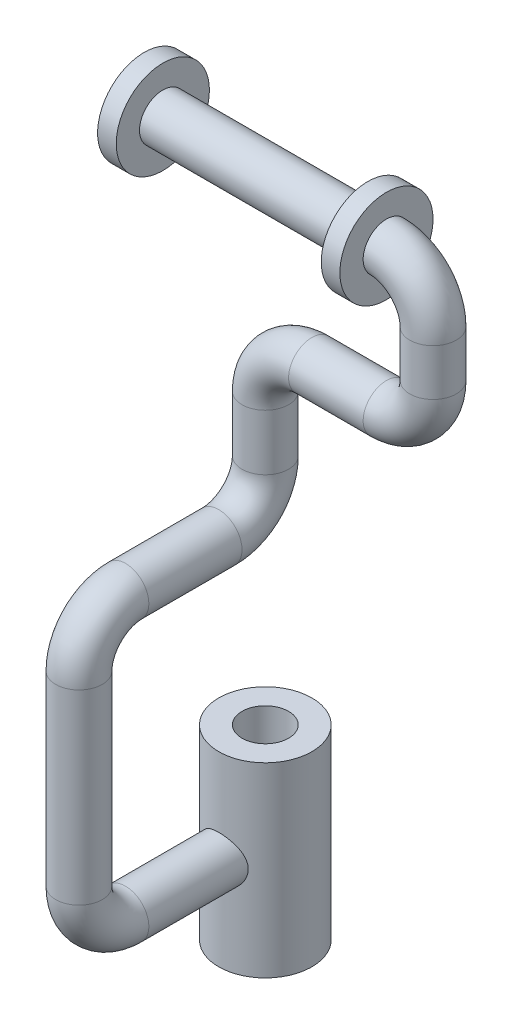
ISO-10303-21;
HEADER;
FILE_DESCRIPTION(('STEP AP214'),'2;1');
FILE_NAME('part.step','',(''),(''),'','','');
FILE_SCHEMA(('AUTOMOTIVE_DESIGN { 1 0 10303 214 1 1 1 1 }'));
ENDSEC;
DATA;
#1=APPLICATION_CONTEXT('core data for automotive mechanical design processes');
#2=APPLICATION_PROTOCOL_DEFINITION('international standard','automotive_design',2000,#1);
#3=PRODUCT_CONTEXT('',#1,'mechanical');
#4=PRODUCT('Part','Part','',(#3));
#5=PRODUCT_RELATED_PRODUCT_CATEGORY('part','',(#4));
#6=PRODUCT_DEFINITION_FORMATION('','',#4);
#7=PRODUCT_DEFINITION_CONTEXT('part definition',#1,'design');
#8=PRODUCT_DEFINITION('design','',#6,#7);
#9=PRODUCT_DEFINITION_SHAPE('','',#8);
#10=(LENGTH_UNIT() NAMED_UNIT(*) SI_UNIT(.MILLI.,.METRE.));
#11=(NAMED_UNIT(*) PLANE_ANGLE_UNIT() SI_UNIT($,.RADIAN.));
#12=(NAMED_UNIT(*) SI_UNIT($,.STERADIAN.) SOLID_ANGLE_UNIT());
#13=UNCERTAINTY_MEASURE_WITH_UNIT(LENGTH_MEASURE(1.E-05),#10,'distance_accuracy_value','');
#14=(GEOMETRIC_REPRESENTATION_CONTEXT(3) GLOBAL_UNCERTAINTY_ASSIGNED_CONTEXT((#13)) GLOBAL_UNIT_ASSIGNED_CONTEXT((#10,
#11,#12)) REPRESENTATION_CONTEXT('',''));
#15=CARTESIAN_POINT('',(0.,0.,0.));
#16=DIRECTION('',(0.,0.,1.));
#17=DIRECTION('',(1.,0.,0.));
#18=AXIS2_PLACEMENT_3D('',#15,#16,#17);
#19=CARTESIAN_POINT('',(13.,-20.,0.));
#20=DIRECTION('',(0.,-1.,0.));
#21=DIRECTION('',(0.,0.,-1.));
#22=AXIS2_PLACEMENT_3D('',#19,#20,#21);
#23=CYLINDRICAL_SURFACE('',#22,2.5);
#24=CARTESIAN_POINT('',(13.,-20.,0.));
#25=DIRECTION('',(0.,-1.,0.));
#26=DIRECTION('',(0.,0.,-1.));
#27=AXIS2_PLACEMENT_3D('',#24,#25,#26);
#28=CIRCLE('',#27,2.5);
#29=CARTESIAN_POINT('',(10.5,-20.,0.));
#30=VERTEX_POINT('',#29);
#31=EDGE_CURVE('E45',#30,#30,#28,.T.);
#32=ORIENTED_EDGE('',*,*,#31,.T.);
#33=EDGE_LOOP('',(#32));
#34=FACE_BOUND('',#33,.T.);
#35=CARTESIAN_POINT('',(13.,-26.,0.));
#36=DIRECTION('',(0.,-1.,0.));
#37=DIRECTION('',(1.,0.,0.));
#38=AXIS2_PLACEMENT_3D('',#35,#36,#37);
#39=CIRCLE('',#38,2.5);
#40=CARTESIAN_POINT('',(13.,-26.,-2.5));
#41=VERTEX_POINT('',#40);
#42=EDGE_CURVE('E96',#41,#41,#39,.T.);
#43=ORIENTED_EDGE('',*,*,#42,.F.);
#44=EDGE_LOOP('',(#43));
#45=FACE_BOUND('',#44,.T.);
#46=ADVANCED_FACE('F31',(#34,#45),#23,.T.);
#47=CARTESIAN_POINT('',(18.,-20.,0.));
#48=DIRECTION('',(0.,0.,1.));
#49=DIRECTION('',(1.,0.,0.));
#50=AXIS2_PLACEMENT_3D('',#47,#48,#49);
#51=TOROIDAL_SURFACE('',#50,5.,2.5);
#52=CARTESIAN_POINT('',(18.,-15.,0.));
#53=DIRECTION('',(-1.,0.,0.));
#54=DIRECTION('',(0.,0.,-1.));
#55=AXIS2_PLACEMENT_3D('',#52,#53,#54);
#56=CIRCLE('',#55,2.5);
#57=CARTESIAN_POINT('',(18.,-12.5,0.));
#58=VERTEX_POINT('',#57);
#59=EDGE_CURVE('E49',#58,#58,#56,.T.);
#60=CARTESIAN_POINT('',(18.,-20.,0.));
#61=DIRECTION('',(0.,0.,1.));
#62=DIRECTION('',(1.,0.,0.));
#63=AXIS2_PLACEMENT_3D('',#60,#61,#62);
#64=CIRCLE('',#63,7.5);
#65=EDGE_CURVE('',#58,#30,#64,.T.);
#66=ORIENTED_EDGE('',*,*,#59,.T.);
#67=ORIENTED_EDGE('',*,*,#31,.F.);
#68=ORIENTED_EDGE('',*,*,#65,.T.);
#69=ORIENTED_EDGE('',*,*,#65,.F.);
#70=EDGE_LOOP('',(#66,#68,#67,#69));
#71=FACE_BOUND('',#70,.T.);
#72=ADVANCED_FACE('F137',(#71),#51,.T.);
#73=CARTESIAN_POINT('',(26.,-15.,0.));
#74=DIRECTION('',(-1.,0.,0.));
#75=DIRECTION('',(0.,-1.,0.));
#76=AXIS2_PLACEMENT_3D('',#73,#74,#75);
#77=CYLINDRICAL_SURFACE('',#76,2.5);
#78=CARTESIAN_POINT('',(26.,-15.,0.));
#79=DIRECTION('',(-1.,0.,0.));
#80=DIRECTION('',(0.,0.,-1.));
#81=AXIS2_PLACEMENT_3D('',#78,#79,#80);
#82=CIRCLE('',#81,2.5);
#83=CARTESIAN_POINT('',(26.,-17.5,0.));
#84=VERTEX_POINT('',#83);
#85=EDGE_CURVE('E59',#84,#84,#82,.T.);
#86=ORIENTED_EDGE('',*,*,#85,.T.);
#87=EDGE_LOOP('',(#86));
#88=FACE_BOUND('',#87,.T.);
#89=ORIENTED_EDGE('',*,*,#59,.F.);
#90=EDGE_LOOP('',(#89));
#91=FACE_BOUND('',#90,.T.);
#92=ADVANCED_FACE('F142',(#88,#91),#77,.T.);
#93=CARTESIAN_POINT('',(26.,-10.,0.));
#94=DIRECTION('',(0.,0.,-1.));
#95=DIRECTION('',(-1.,0.,0.));
#96=AXIS2_PLACEMENT_3D('',#93,#94,#95);
#97=TOROIDAL_SURFACE('',#96,5.,2.5);
#98=CARTESIAN_POINT('',(31.,-10.,0.));
#99=DIRECTION('',(0.,-1.,0.));
#100=DIRECTION('',(0.,0.,-1.));
#101=AXIS2_PLACEMENT_3D('',#98,#99,#100);
#102=CIRCLE('',#101,2.5);
#103=CARTESIAN_POINT('',(33.5,-10.,0.));
#104=VERTEX_POINT('',#103);
#105=EDGE_CURVE('E62',#104,#104,#102,.T.);
#106=CARTESIAN_POINT('',(26.,-10.,0.));
#107=DIRECTION('',(0.,0.,-1.));
#108=DIRECTION('',(-1.,0.,0.));
#109=AXIS2_PLACEMENT_3D('',#106,#107,#108);
#110=CIRCLE('',#109,7.5);
#111=EDGE_CURVE('',#104,#84,#110,.T.);
#112=ORIENTED_EDGE('',*,*,#105,.T.);
#113=ORIENTED_EDGE('',*,*,#85,.F.);
#114=ORIENTED_EDGE('',*,*,#111,.T.);
#115=ORIENTED_EDGE('',*,*,#111,.F.);
#116=EDGE_LOOP('',(#112,#114,#113,#115));
#117=FACE_BOUND('',#116,.T.);
#118=ADVANCED_FACE('F219',(#117),#97,.T.);
#119=CARTESIAN_POINT('',(31.,-5.,0.));
#120=DIRECTION('',(0.,-1.,0.));
#121=DIRECTION('',(0.,0.,-1.));
#122=AXIS2_PLACEMENT_3D('',#119,#120,#121);
#123=CYLINDRICAL_SURFACE('',#122,2.5);
#124=CARTESIAN_POINT('',(31.,-5.,0.));
#125=DIRECTION('',(0.,-1.,0.));
#126=DIRECTION('',(0.,0.,-1.));
#127=AXIS2_PLACEMENT_3D('',#124,#125,#126);
#128=CIRCLE('',#127,2.5);
#129=CARTESIAN_POINT('',(33.5,-5.,0.));
#130=VERTEX_POINT('',#129);
#131=EDGE_CURVE('E54',#130,#130,#128,.T.);
#132=ORIENTED_EDGE('',*,*,#131,.T.);
#133=EDGE_LOOP('',(#132));
#134=FACE_BOUND('',#133,.T.);
#135=ORIENTED_EDGE('',*,*,#105,.F.);
#136=EDGE_LOOP('',(#135));
#137=FACE_BOUND('',#136,.T.);
#138=ADVANCED_FACE('F215',(#134,#137),#123,.T.);
#139=CARTESIAN_POINT('',(26.,-5.,0.));
#140=DIRECTION('',(0.,0.,-1.));
#141=DIRECTION('',(-1.,0.,0.));
#142=AXIS2_PLACEMENT_3D('',#139,#140,#141);
#143=TOROIDAL_SURFACE('',#142,5.,2.5);
#144=CARTESIAN_POINT('',(26.,0.,0.));
#145=DIRECTION('',(1.,0.,0.));
#146=DIRECTION('',(0.,0.,-1.));
#147=AXIS2_PLACEMENT_3D('',#144,#145,#146);
#148=CIRCLE('',#147,2.5);
#149=CARTESIAN_POINT('',(26.,2.5,0.));
#150=VERTEX_POINT('',#149);
#151=EDGE_CURVE('E70',#150,#150,#148,.T.);
#152=CARTESIAN_POINT('',(26.,-5.,0.));
#153=DIRECTION('',(0.,0.,-1.));
#154=DIRECTION('',(-1.,0.,0.));
#155=AXIS2_PLACEMENT_3D('',#152,#153,#154);
#156=CIRCLE('',#155,7.5);
#157=EDGE_CURVE('',#150,#130,#156,.T.);
#158=ORIENTED_EDGE('',*,*,#151,.T.);
#159=ORIENTED_EDGE('',*,*,#131,.F.);
#160=ORIENTED_EDGE('',*,*,#157,.T.);
#161=ORIENTED_EDGE('',*,*,#157,.F.);
#162=EDGE_LOOP('',(#158,#160,#159,#161));
#163=FACE_BOUND('',#162,.T.);
#164=ADVANCED_FACE('F193',(#163),#143,.T.);
#165=CARTESIAN_POINT('',(24.,0.,0.));
#166=DIRECTION('',(1.,0.,0.));
#167=DIRECTION('',(0.,0.,-1.));
#168=AXIS2_PLACEMENT_3D('',#165,#166,#167);
#169=PLANE('',#168);
#170=CARTESIAN_POINT('',(24.,0.,0.));
#171=DIRECTION('',(1.,0.,0.));
#172=DIRECTION('',(0.,0.,-1.));
#173=AXIS2_PLACEMENT_3D('',#170,#171,#172);
#174=CIRCLE('',#173,5.);
#175=CARTESIAN_POINT('',(24.,0.,-5.));
#176=VERTEX_POINT('',#175);
#177=EDGE_CURVE('E75',#176,#176,#174,.T.);
#178=ORIENTED_EDGE('',*,*,#177,.F.);
#179=EDGE_LOOP('',(#178));
#180=FACE_BOUND('',#179,.T.);
#181=CARTESIAN_POINT('',(24.,0.,0.));
#182=DIRECTION('',(1.,0.,0.));
#183=DIRECTION('',(0.,0.,-1.));
#184=AXIS2_PLACEMENT_3D('',#181,#182,#183);
#185=CIRCLE('',#184,2.5);
#186=CARTESIAN_POINT('',(24.,0.,2.5));
#187=VERTEX_POINT('',#186);
#188=EDGE_CURVE('E41',#187,#187,#185,.T.);
#189=ORIENTED_EDGE('',*,*,#188,.T.);
#190=EDGE_LOOP('',(#189));
#191=FACE_BOUND('',#190,.T.);
#192=ADVANCED_FACE('F189',(#180,#191),#169,.F.);
#193=CARTESIAN_POINT('',(26.,0.,0.));
#194=DIRECTION('',(1.,0.,0.));
#195=DIRECTION('',(0.,0.,-1.));
#196=AXIS2_PLACEMENT_3D('',#193,#194,#195);
#197=PLANE('',#196);
#198=CARTESIAN_POINT('',(26.,0.,0.));
#199=DIRECTION('',(1.,0.,0.));
#200=DIRECTION('',(0.,0.,-1.));
#201=AXIS2_PLACEMENT_3D('',#198,#199,#200);
#202=CIRCLE('',#201,5.);
#203=CARTESIAN_POINT('',(26.,0.,-5.));
#204=VERTEX_POINT('',#203);
#205=EDGE_CURVE('E76',#204,#204,#202,.T.);
#206=ORIENTED_EDGE('',*,*,#205,.T.);
#207=EDGE_LOOP('',(#206));
#208=FACE_BOUND('',#207,.T.);
#209=ORIENTED_EDGE('',*,*,#151,.F.);
#210=EDGE_LOOP('',(#209));
#211=FACE_BOUND('',#210,.T.);
#212=ADVANCED_FACE('F192',(#208,#211),#197,.T.);
#213=CARTESIAN_POINT('',(24.,0.,0.));
#214=DIRECTION('',(1.,0.,0.));
#215=DIRECTION('',(0.,0.,-1.));
#216=AXIS2_PLACEMENT_3D('',#213,#214,#215);
#217=CYLINDRICAL_SURFACE('',#216,5.);
#218=ORIENTED_EDGE('',*,*,#177,.T.);
#219=EDGE_LOOP('',(#218));
#220=FACE_BOUND('',#219,.T.);
#221=ORIENTED_EDGE('',*,*,#205,.F.);
#222=EDGE_LOOP('',(#221));
#223=FACE_BOUND('',#222,.T.);
#224=ADVANCED_FACE('F197',(#220,#223),#217,.T.);
#225=CARTESIAN_POINT('',(0.,0.,0.));
#226=DIRECTION('',(1.,0.,0.));
#227=DIRECTION('',(0.,0.,-1.));
#228=AXIS2_PLACEMENT_3D('',#225,#226,#227);
#229=PLANE('',#228);
#230=CARTESIAN_POINT('',(0.,0.,0.));
#231=DIRECTION('',(1.,0.,0.));
#232=DIRECTION('',(0.,0.,-1.));
#233=AXIS2_PLACEMENT_3D('',#230,#231,#232);
#234=CIRCLE('',#233,5.);
#235=CARTESIAN_POINT('',(0.,0.,-5.));
#236=VERTEX_POINT('',#235);
#237=EDGE_CURVE('E67',#236,#236,#234,.T.);
#238=ORIENTED_EDGE('',*,*,#237,.F.);
#239=EDGE_LOOP('',(#238));
#240=FACE_BOUND('',#239,.T.);
#241=ADVANCED_FACE('F201',(#240),#229,.F.);
#242=CARTESIAN_POINT('',(2.,0.,0.));
#243=DIRECTION('',(-1.,0.,0.));
#244=DIRECTION('',(0.,0.,1.));
#245=AXIS2_PLACEMENT_3D('',#242,#243,#244);
#246=CYLINDRICAL_SURFACE('',#245,5.);
#247=CARTESIAN_POINT('',(2.,0.,0.));
#248=DIRECTION('',(1.,0.,0.));
#249=DIRECTION('',(0.,0.,-1.));
#250=AXIS2_PLACEMENT_3D('',#247,#248,#249);
#251=CIRCLE('',#250,5.);
#252=CARTESIAN_POINT('',(2.,0.,-5.));
#253=VERTEX_POINT('',#252);
#254=EDGE_CURVE('E55',#253,#253,#251,.T.);
#255=ORIENTED_EDGE('',*,*,#254,.F.);
#256=EDGE_LOOP('',(#255));
#257=FACE_BOUND('',#256,.T.);
#258=ORIENTED_EDGE('',*,*,#237,.T.);
#259=EDGE_LOOP('',(#258));
#260=FACE_BOUND('',#259,.T.);
#261=ADVANCED_FACE('F205',(#257,#260),#246,.T.);
#262=CARTESIAN_POINT('',(2.,0.,0.));
#263=DIRECTION('',(1.,0.,0.));
#264=DIRECTION('',(0.,0.,-1.));
#265=AXIS2_PLACEMENT_3D('',#262,#263,#264);
#266=PLANE('',#265);
#267=ORIENTED_EDGE('',*,*,#254,.T.);
#268=EDGE_LOOP('',(#267));
#269=FACE_BOUND('',#268,.T.);
#270=CARTESIAN_POINT('',(2.,0.,0.));
#271=DIRECTION('',(1.,0.,0.));
#272=DIRECTION('',(0.,0.,-1.));
#273=AXIS2_PLACEMENT_3D('',#270,#271,#272);
#274=CIRCLE('',#273,2.5);
#275=CARTESIAN_POINT('',(1.99999999999999,0.,2.5));
#276=VERTEX_POINT('',#275);
#277=EDGE_CURVE('E52',#276,#276,#274,.T.);
#278=ORIENTED_EDGE('',*,*,#277,.F.);
#279=EDGE_LOOP('',(#278));
#280=FACE_BOUND('',#279,.T.);
#281=ADVANCED_FACE('F184',(#269,#280),#266,.T.);
#282=CARTESIAN_POINT('',(26.,0.,0.));
#283=DIRECTION('',(-1.,0.,0.));
#284=DIRECTION('',(0.,0.,1.));
#285=AXIS2_PLACEMENT_3D('',#282,#283,#284);
#286=CYLINDRICAL_SURFACE('',#285,2.5);
#287=CARTESIAN_POINT('',(1.99999999999999,0.,2.5));
#288=CARTESIAN_POINT('',(2.22916666666666,0.,2.5));
#289=CARTESIAN_POINT('',(2.45833333333333,0.,2.5));
#290=CARTESIAN_POINT('',(2.91666666666666,0.,2.5));
#291=CARTESIAN_POINT('',(3.14583333333333,0.,2.5));
#292=CARTESIAN_POINT('',(3.60416666666666,0.,2.5));
#293=CARTESIAN_POINT('',(3.83333333333333,0.,2.5));
#294=CARTESIAN_POINT('',(4.29166666666666,0.,2.5));
#295=CARTESIAN_POINT('',(4.52083333333333,0.,2.5));
#296=CARTESIAN_POINT('',(4.97916666666666,0.,2.5));
#297=CARTESIAN_POINT('',(5.20833333333333,0.,2.5));
#298=CARTESIAN_POINT('',(5.66666666666666,0.,2.5));
#299=CARTESIAN_POINT('',(5.89583333333333,0.,2.5));
#300=CARTESIAN_POINT('',(6.35416666666666,0.,2.5));
#301=CARTESIAN_POINT('',(6.58333333333333,0.,2.5));
#302=CARTESIAN_POINT('',(7.04166666666666,0.,2.5));
#303=CARTESIAN_POINT('',(7.27083333333333,0.,2.5));
#304=CARTESIAN_POINT('',(7.72916666666666,0.,2.5));
#305=CARTESIAN_POINT('',(7.95833333333333,0.,2.5));
#306=CARTESIAN_POINT('',(8.41666666666666,0.,2.5));
#307=CARTESIAN_POINT('',(8.64583333333333,0.,2.5));
#308=CARTESIAN_POINT('',(9.10416666666666,0.,2.5));
#309=CARTESIAN_POINT('',(9.33333333333333,0.,2.5));
#310=CARTESIAN_POINT('',(9.79166666666666,0.,2.5));
#311=CARTESIAN_POINT('',(10.0208333333333,0.,2.5));
#312=CARTESIAN_POINT('',(10.4791666666667,0.,2.5));
#313=CARTESIAN_POINT('',(10.7083333333333,0.,2.5));
#314=CARTESIAN_POINT('',(11.1666666666667,0.,2.5));
#315=CARTESIAN_POINT('',(11.3958333333333,0.,2.5));
#316=CARTESIAN_POINT('',(11.8541666666667,0.,2.5));
#317=CARTESIAN_POINT('',(12.0833333333333,0.,2.5));
#318=CARTESIAN_POINT('',(12.5416666666667,0.,2.5));
#319=CARTESIAN_POINT('',(12.7708333333333,0.,2.5));
#320=CARTESIAN_POINT('',(13.2291666666667,0.,2.5));
#321=CARTESIAN_POINT('',(13.4583333333333,0.,2.5));
#322=CARTESIAN_POINT('',(13.9166666666667,0.,2.5));
#323=CARTESIAN_POINT('',(14.1458333333333,0.,2.5));
#324=CARTESIAN_POINT('',(14.6041666666667,0.,2.5));
#325=CARTESIAN_POINT('',(14.8333333333333,0.,2.5));
#326=CARTESIAN_POINT('',(15.2916666666667,0.,2.5));
#327=CARTESIAN_POINT('',(15.5208333333333,0.,2.5));
#328=CARTESIAN_POINT('',(15.9791666666667,0.,2.5));
#329=CARTESIAN_POINT('',(16.2083333333333,0.,2.5));
#330=CARTESIAN_POINT('',(16.6666666666667,0.,2.5));
#331=CARTESIAN_POINT('',(16.8958333333333,0.,2.5));
#332=CARTESIAN_POINT('',(17.3541666666667,0.,2.5));
#333=CARTESIAN_POINT('',(17.5833333333333,0.,2.5));
#334=CARTESIAN_POINT('',(18.0416666666667,0.,2.5));
#335=CARTESIAN_POINT('',(18.2708333333333,0.,2.5));
#336=CARTESIAN_POINT('',(18.7291666666667,0.,2.5));
#337=CARTESIAN_POINT('',(18.9583333333333,0.,2.5));
#338=CARTESIAN_POINT('',(19.4166666666667,0.,2.5));
#339=CARTESIAN_POINT('',(19.6458333333333,0.,2.5));
#340=CARTESIAN_POINT('',(20.1041666666667,0.,2.5));
#341=CARTESIAN_POINT('',(20.3333333333333,0.,2.5));
#342=CARTESIAN_POINT('',(20.7916666666667,0.,2.5));
#343=CARTESIAN_POINT('',(21.0208333333333,0.,2.5));
#344=CARTESIAN_POINT('',(21.4791666666667,0.,2.5));
#345=CARTESIAN_POINT('',(21.7083333333333,0.,2.5));
#346=CARTESIAN_POINT('',(22.1666666666667,0.,2.5));
#347=CARTESIAN_POINT('',(22.3958333333333,0.,2.5));
#348=CARTESIAN_POINT('',(22.8541666666667,0.,2.5));
#349=CARTESIAN_POINT('',(23.0833333333333,0.,2.5));
#350=CARTESIAN_POINT('',(23.5416666666667,0.,2.5));
#351=CARTESIAN_POINT('',(23.7708333333333,0.,2.5));
#352=CARTESIAN_POINT('',(24.,0.,2.5));
#353=B_SPLINE_CURVE_WITH_KNOTS('',3,(#287,#288,#289,#290,#291,#292,#293,#294,#295,#296,#297,
#298,#299,#300,#301,#302,#303,#304,#305,#306,#307,#308,#309,#310,#311,#312,#313,#314,#315,#316,
#317,#318,#319,#320,#321,#322,#323,#324,#325,#326,#327,#328,#329,#330,#331,#332,#333,#334,#335,
#336,#337,#338,#339,#340,#341,#342,#343,#344,#345,#346,#347,#348,#349,#350,#351,#352),
.UNSPECIFIED.,.F.,.F.,(4,2,2,2,2,2,2,2,2,2,2,2,2,2,2,2,2,2,2,2,2,2,2,2,2,2,2,2,2,2,2,2,4),(0.,
0.687500000000001,1.375,2.0625,2.75,3.4375,4.125,4.8125,5.5,6.1875,6.875,7.5625,8.25,8.9375,
9.625,10.3125,11.,11.6875,12.375,13.0625,13.75,14.4375,15.125,15.8125,16.5,17.1875,17.875,
18.5625,19.25,19.9375,20.625,21.3125,22.),.UNSPECIFIED.);
#354=EDGE_CURVE('BSEAM179',#276,#187,#353,.T.);
#355=ORIENTED_EDGE('',*,*,#277,.T.);
#356=ORIENTED_EDGE('',*,*,#188,.F.);
#357=ORIENTED_EDGE('',*,*,#354,.T.);
#358=ORIENTED_EDGE('',*,*,#354,.F.);
#359=EDGE_LOOP('',(#355,#357,#356,#358));
#360=FACE_BOUND('',#359,.T.);
#361=ADVANCED_FACE('F179',(#360),#286,.T.);
#362=CARTESIAN_POINT('',(13.,-61.,15.));
#363=DIRECTION('',(0.,0.,-1.));
#364=DIRECTION('',(0.,1.,0.));
#365=AXIS2_PLACEMENT_3D('',#362,#363,#364);
#366=CYLINDRICAL_SURFACE('',#365,2.5);
#367=CARTESIAN_POINT('',(13.,-58.5,5.));
#368=CARTESIAN_POINT('',(13.1314266823343,-58.500009669056,4.99999177550472));
#369=CARTESIAN_POINT('',(13.2630156344372,-58.510425561774,4.99476199135278));
#370=CARTESIAN_POINT('',(13.5223014546229,-58.551631821162,4.9743541856102));
#371=CARTESIAN_POINT('',(13.6499904485641,-58.582460880925,4.95915727187671));
#372=CARTESIAN_POINT('',(13.8973336313162,-58.6629846227188,4.92040690922477));
#373=CARTESIAN_POINT('',(14.0170169453628,-58.7126059877827,4.8968859590726));
#374=CARTESIAN_POINT('',(14.2461816039967,-58.8289265262518,4.84364443325827));
#375=CARTESIAN_POINT('',(14.3556637520377,-58.8956243531451,4.81392434644421));
#376=CARTESIAN_POINT('',(14.56876952631,-59.0487931316426,4.74890645050632));
#377=CARTESIAN_POINT('',(14.6716380229431,-59.1362162002298,4.71337997659091));
#378=CARTESIAN_POINT('',(14.8619486170333,-59.3263036959853,4.64149925776731));
#379=CARTESIAN_POINT('',(14.9493789591156,-59.4289796288401,4.60514440566898));
#380=CARTESIAN_POINT('',(15.1131299996725,-59.6562083744453,4.53247377945622));
#381=CARTESIAN_POINT('',(15.1880633384906,-59.781840246035,4.49637967412567));
#382=CARTESIAN_POINT('',(15.3154205676149,-60.0459183397954,4.43214946943555));
#383=CARTESIAN_POINT('',(15.3678605375168,-60.1843553217626,4.40400769020792));
#384=CARTESIAN_POINT('',(15.4453311053765,-60.4616627635964,4.36144667591402));
#385=CARTESIAN_POINT('',(15.4718146426758,-60.6000111301796,4.34630678958452));
#386=CARTESIAN_POINT('',(15.5010674832974,-60.8799470944376,4.32954724872151));
#387=CARTESIAN_POINT('',(15.5038602209391,-61.0215313521751,4.3279142335843));
#388=CARTESIAN_POINT('',(15.4867182179251,-61.2857150607909,4.33777325642937));
#389=CARTESIAN_POINT('',(15.4694613988405,-61.4085600780583,4.34771909154985));
#390=CARTESIAN_POINT('',(15.4173496226438,-61.6493047734319,4.37690571834676));
#391=CARTESIAN_POINT('',(15.3824890597445,-61.7672028632631,4.39614947079455));
#392=CARTESIAN_POINT('',(15.2955244509646,-61.9980728314143,4.44218691031839));
#393=CARTESIAN_POINT('',(15.2430376677899,-62.1108659969645,4.46914601659993));
#394=CARTESIAN_POINT('',(15.1226042191701,-62.326585731475,4.52758510703513));
#395=CARTESIAN_POINT('',(15.0546506095312,-62.4295078390002,4.55906711950478));
#396=CARTESIAN_POINT('',(14.8951651372819,-62.6363031318581,4.62782894758214));
#397=CARTESIAN_POINT('',(14.8017361459232,-62.7386421839404,4.66533775591865));
#398=CARTESIAN_POINT('',(14.5988889468534,-62.9268385464772,4.73869058251019));
#399=CARTESIAN_POINT('',(14.4894631414357,-63.0126879800847,4.77453379897003));
#400=CARTESIAN_POINT('',(14.2512912645796,-63.1692141525743,4.84254968207409));
#401=CARTESIAN_POINT('',(14.1218839789985,-63.2390011811143,4.87447460405016));
#402=CARTESIAN_POINT('',(13.851165538722,-63.3552425726075,4.92894702803109));
#403=CARTESIAN_POINT('',(13.7098639406632,-63.4017154625379,4.95150197358894));
#404=CARTESIAN_POINT('',(13.4319162291518,-63.4661885092917,4.98310834353579));
#405=CARTESIAN_POINT('',(13.2958538263709,-63.486228089367,4.9931234575324));
#406=CARTESIAN_POINT('',(13.0219489998733,-63.5036618278362,5.00182533647794));
#407=CARTESIAN_POINT('',(12.8841074503249,-63.5010667140985,5.00051746803426));
#408=CARTESIAN_POINT('',(12.6219175700353,-63.4744832789533,4.98727980633469));
#409=CARTESIAN_POINT('',(12.4973514798763,-63.4521686681756,4.97618114219993));
#410=CARTESIAN_POINT('',(12.253982769244,-63.3894048202616,4.9455542828753));
#411=CARTESIAN_POINT('',(12.1351807857681,-63.3489535838641,4.92602515837625));
#412=CARTESIAN_POINT('',(11.9027784788804,-63.2500038339196,4.87960628532329));
#413=CARTESIAN_POINT('',(11.7894240075017,-63.1910223747177,4.85252204417873));
#414=CARTESIAN_POINT('',(11.5738465957356,-63.0572311608752,4.79359935799751));
#415=CARTESIAN_POINT('',(11.471628425498,-62.9824146634801,4.76175888940535));
#416=CARTESIAN_POINT('',(11.2705807768451,-62.8105989367091,4.69270553315087));
#417=CARTESIAN_POINT('',(11.173069805715,-62.7121428290248,4.65527212009488));
#418=CARTESIAN_POINT('',(10.9953591974278,-62.5001871219505,4.58155978921587));
#419=CARTESIAN_POINT('',(10.9151715357131,-62.3866772029301,4.54528168472407));
#420=CARTESIAN_POINT('',(10.77073021381,-62.1408908645153,4.4762798054528));
#421=CARTESIAN_POINT('',(10.7074362607776,-62.0079718347088,4.44381323981254));
#422=CARTESIAN_POINT('',(10.6047929348854,-61.7312248311174,4.38935180726746));
#423=CARTESIAN_POINT('',(10.5654127092294,-61.587411184,4.36734345549014));
#424=CARTESIAN_POINT('',(10.5153457823299,-61.307724442637,4.33903752569352));
#425=CARTESIAN_POINT('',(10.5022675125564,-61.172414365881,4.33143458674097));
#426=CARTESIAN_POINT('',(10.498277110491,-60.9013823326193,4.32913386592579));
#427=CARTESIAN_POINT('',(10.5073553701673,-60.7656605801264,4.33443049025111));
#428=CARTESIAN_POINT('',(10.5451846980267,-60.5112912443831,4.35594655164664));
#429=CARTESIAN_POINT('',(10.571979256973,-60.3922488182792,4.37107736338133));
#430=CARTESIAN_POINT('',(10.6420615615946,-60.1604797078,4.40927540337603));
#431=CARTESIAN_POINT('',(10.6853546127127,-60.0477550684334,4.43234518434966));
#432=CARTESIAN_POINT('',(10.7904608068446,-59.8234378472803,4.48571326433413));
#433=CARTESIAN_POINT('',(10.853322809906,-59.712430148265,4.5163930799845));
#434=CARTESIAN_POINT('',(10.9946219161201,-59.5018137567599,4.58088327077456));
#435=CARTESIAN_POINT('',(11.0730671223411,-59.4022110373713,4.61469526970767));
#436=CARTESIAN_POINT('',(11.2544944305393,-59.2046446362504,4.68655816327011));
#437=CARTESIAN_POINT('',(11.3592997753079,-59.1083506358286,4.72462491514981));
#438=CARTESIAN_POINT('',(11.5846021457932,-58.9343441505719,4.79694347383546));
#439=CARTESIAN_POINT('',(11.7051075757367,-58.8566416813941,4.83119321905447));
#440=CARTESIAN_POINT('',(11.9602119112146,-58.7219030205159,4.89245149457782));
#441=CARTESIAN_POINT('',(12.0949044392177,-58.6650168322155,4.91940711437489));
#442=CARTESIAN_POINT('',(12.3036712907426,-58.5978161412076,4.95177960923351));
#443=CARTESIAN_POINT('',(12.3743295865059,-58.5784446019982,4.96122314081874));
#444=CARTESIAN_POINT('',(12.5173760021607,-58.5459340516294,4.97717127275101));
#445=CARTESIAN_POINT('',(12.5897630369076,-58.5327912333236,4.98367766823159));
#446=CARTESIAN_POINT('',(12.7184813153783,-58.5152625277154,4.9923820076613));
#447=CARTESIAN_POINT('',(12.7745915004446,-58.5095450634687,4.99523288466454));
#448=CARTESIAN_POINT('',(12.8871244715437,-58.5019116705343,4.99904367329659));
#449=CARTESIAN_POINT('',(12.9435472661618,-58.4999958467745,5.00000353273198));
#450=CARTESIAN_POINT('',(13.,-58.5,5.));
#451=B_SPLINE_CURVE_WITH_KNOTS('',3,(#367,#368,#369,#370,#371,#372,#373,#374,#375,#376,#377,
#378,#379,#380,#381,#382,#383,#384,#385,#386,#387,#388,#389,#390,#391,#392,#393,#394,#395,#396,
#397,#398,#399,#400,#401,#402,#403,#404,#405,#406,#407,#408,#409,#410,#411,#412,#413,#414,#415,
#416,#417,#418,#419,#420,#421,#422,#423,#424,#425,#426,#427,#428,#429,#430,#431,#432,#433,#434,
#435,#436,#437,#438,#439,#440,#441,#442,#443,#444,#445,#446,#447,#448,#449,#450),.UNSPECIFIED.,
.T.,.F.,(4,2,2,2,2,2,2,2,2,2,2,2,2,2,2,2,2,2,2,2,2,2,2,2,2,2,2,2,2,2,2,2,2,2,2,2,2,2,2,2,2,4),
(0.,0.39406064355073,0.788870374272993,1.18215538873074,1.57540940145392,1.99245439679522,
2.40981559413509,2.85954316076882,3.30894869745702,3.73145030350574,4.15353393322551,
4.52514281023302,4.89687009814197,5.27725600421219,5.65781303150555,6.08662353334695,
6.51563836496716,6.96457555536101,7.41315542280698,7.82458226178364,8.2358141127869,
8.61517266265305,8.99457304077329,9.38482140069747,9.77523626870848,10.2039902661037,
10.6330397153795,11.0828670540368,11.53211279863,11.9382326875698,12.3441764966107,
12.7114482562151,13.0788382197025,13.4709114195009,13.8631890285845,14.303131068923,
14.7433095845248,15.1866003415819,15.407934939208,15.6291340766843,15.7983933645035,
15.9676573239323),.UNSPECIFIED.);
#452=CARTESIAN_POINT('',(13.,-58.5,5.));
#453=VERTEX_POINT('',#452);
#454=EDGE_CURVE('E10',#453,#453,#451,.T.);
#455=ORIENTED_EDGE('',*,*,#454,.F.);
#456=EDGE_LOOP('',(#455));
#457=FACE_BOUND('',#456,.T.);
#458=CARTESIAN_POINT('',(13.,-61.,15.));
#459=DIRECTION('',(0.,0.,-1.));
#460=DIRECTION('',(1.,0.,0.));
#461=AXIS2_PLACEMENT_3D('',#458,#459,#460);
#462=CIRCLE('',#461,2.5);
#463=CARTESIAN_POINT('',(13.,-63.5,15.));
#464=VERTEX_POINT('',#463);
#465=EDGE_CURVE('E79',#464,#464,#462,.T.);
#466=ORIENTED_EDGE('',*,*,#465,.T.);
#467=EDGE_LOOP('',(#466));
#468=FACE_BOUND('',#467,.T.);
#469=ADVANCED_FACE('F174',(#457,#468),#366,.T.);
#470=CARTESIAN_POINT('',(13.,-56.,15.));
#471=DIRECTION('',(1.,0.,0.));
#472=DIRECTION('',(0.,0.,-1.));
#473=AXIS2_PLACEMENT_3D('',#470,#471,#472);
#474=TOROIDAL_SURFACE('',#473,5.,2.5);
#475=CARTESIAN_POINT('',(13.,-56.,20.));
#476=DIRECTION('',(0.,-1.,0.));
#477=DIRECTION('',(1.,0.,0.));
#478=AXIS2_PLACEMENT_3D('',#475,#476,#477);
#479=CIRCLE('',#478,2.5);
#480=CARTESIAN_POINT('',(13.,-56.,22.5));
#481=VERTEX_POINT('',#480);
#482=EDGE_CURVE('E84',#481,#481,#479,.T.);
#483=CARTESIAN_POINT('',(13.,-56.,15.));
#484=DIRECTION('',(1.,0.,0.));
#485=DIRECTION('',(0.,0.,-1.));
#486=AXIS2_PLACEMENT_3D('',#483,#484,#485);
#487=CIRCLE('',#486,7.5);
#488=EDGE_CURVE('',#481,#464,#487,.T.);
#489=ORIENTED_EDGE('',*,*,#482,.T.);
#490=ORIENTED_EDGE('',*,*,#465,.F.);
#491=ORIENTED_EDGE('',*,*,#488,.T.);
#492=ORIENTED_EDGE('',*,*,#488,.F.);
#493=EDGE_LOOP('',(#489,#491,#490,#492));
#494=FACE_BOUND('',#493,.T.);
#495=ADVANCED_FACE('F168',(#494),#474,.T.);
#496=CARTESIAN_POINT('',(13.,-36.,20.));
#497=DIRECTION('',(0.,-1.,0.));
#498=DIRECTION('',(0.,0.,-1.));
#499=AXIS2_PLACEMENT_3D('',#496,#497,#498);
#500=CYLINDRICAL_SURFACE('',#499,2.5);
#501=CARTESIAN_POINT('',(13.,-36.,20.));
#502=DIRECTION('',(0.,-1.,0.));
#503=DIRECTION('',(1.,0.,0.));
#504=AXIS2_PLACEMENT_3D('',#501,#502,#503);
#505=CIRCLE('',#504,2.5);
#506=CARTESIAN_POINT('',(13.,-36.,22.5));
#507=VERTEX_POINT('',#506);
#508=EDGE_CURVE('E87',#507,#507,#505,.T.);
#509=ORIENTED_EDGE('',*,*,#508,.T.);
#510=EDGE_LOOP('',(#509));
#511=FACE_BOUND('',#510,.T.);
#512=ORIENTED_EDGE('',*,*,#482,.F.);
#513=EDGE_LOOP('',(#512));
#514=FACE_BOUND('',#513,.T.);
#515=ADVANCED_FACE('F162',(#511,#514),#500,.T.);
#516=CARTESIAN_POINT('',(13.,-36.,15.));
#517=DIRECTION('',(1.,0.,0.));
#518=DIRECTION('',(0.,0.,-1.));
#519=AXIS2_PLACEMENT_3D('',#516,#517,#518);
#520=TOROIDAL_SURFACE('',#519,5.,2.5);
#521=CARTESIAN_POINT('',(13.,-31.,15.));
#522=DIRECTION('',(0.,0.,1.));
#523=DIRECTION('',(1.,0.,0.));
#524=AXIS2_PLACEMENT_3D('',#521,#522,#523);
#525=CIRCLE('',#524,2.5);
#526=CARTESIAN_POINT('',(13.,-28.5,15.));
#527=VERTEX_POINT('',#526);
#528=EDGE_CURVE('E90',#527,#527,#525,.T.);
#529=CARTESIAN_POINT('',(13.,-36.,15.));
#530=DIRECTION('',(1.,0.,0.));
#531=DIRECTION('',(0.,0.,-1.));
#532=AXIS2_PLACEMENT_3D('',#529,#530,#531);
#533=CIRCLE('',#532,7.5);
#534=EDGE_CURVE('',#527,#507,#533,.T.);
#535=ORIENTED_EDGE('',*,*,#528,.T.);
#536=ORIENTED_EDGE('',*,*,#508,.F.);
#537=ORIENTED_EDGE('',*,*,#534,.T.);
#538=ORIENTED_EDGE('',*,*,#534,.F.);
#539=EDGE_LOOP('',(#535,#537,#536,#538));
#540=FACE_BOUND('',#539,.T.);
#541=ADVANCED_FACE('F156',(#540),#520,.T.);
#542=CARTESIAN_POINT('',(13.,-31.,5.));
#543=DIRECTION('',(0.,0.,1.));
#544=DIRECTION('',(1.,0.,0.));
#545=AXIS2_PLACEMENT_3D('',#542,#543,#544);
#546=CYLINDRICAL_SURFACE('',#545,2.5);
#547=CARTESIAN_POINT('',(13.,-31.,5.));
#548=DIRECTION('',(0.,0.,1.));
#549=DIRECTION('',(1.,0.,0.));
#550=AXIS2_PLACEMENT_3D('',#547,#548,#549);
#551=CIRCLE('',#550,2.5);
#552=CARTESIAN_POINT('',(13.,-33.5,5.00000000000001));
#553=VERTEX_POINT('',#552);
#554=EDGE_CURVE('E93',#553,#553,#551,.T.);
#555=ORIENTED_EDGE('',*,*,#554,.T.);
#556=EDGE_LOOP('',(#555));
#557=FACE_BOUND('',#556,.T.);
#558=ORIENTED_EDGE('',*,*,#528,.F.);
#559=EDGE_LOOP('',(#558));
#560=FACE_BOUND('',#559,.T.);
#561=ADVANCED_FACE('F150',(#557,#560),#546,.T.);
#562=CARTESIAN_POINT('',(13.,-26.,5.));
#563=DIRECTION('',(-1.,0.,0.));
#564=DIRECTION('',(0.,0.,1.));
#565=AXIS2_PLACEMENT_3D('',#562,#563,#564);
#566=TOROIDAL_SURFACE('',#565,5.,2.5);
#567=CARTESIAN_POINT('',(13.,-26.,5.));
#568=DIRECTION('',(-1.,0.,0.));
#569=DIRECTION('',(0.,0.,1.));
#570=AXIS2_PLACEMENT_3D('',#567,#568,#569);
#571=CIRCLE('',#570,7.5);
#572=EDGE_CURVE('',#41,#553,#571,.T.);
#573=ORIENTED_EDGE('',*,*,#42,.T.);
#574=ORIENTED_EDGE('',*,*,#554,.F.);
#575=ORIENTED_EDGE('',*,*,#572,.T.);
#576=ORIENTED_EDGE('',*,*,#572,.F.);
#577=EDGE_LOOP('',(#573,#575,#574,#576));
#578=FACE_BOUND('',#577,.T.);
#579=ADVANCED_FACE('F124',(#578),#566,.T.);
#580=CARTESIAN_POINT('',(13.,-51.,0.));
#581=DIRECTION('',(0.,-1.,0.));
#582=DIRECTION('',(0.,0.,-1.));
#583=AXIS2_PLACEMENT_3D('',#580,#581,#582);
#584=CYLINDRICAL_SURFACE('',#583,5.);
#585=ORIENTED_EDGE('',*,*,#454,.T.);
#586=EDGE_LOOP('',(#585));
#587=FACE_BOUND('',#586,.T.);
#588=CARTESIAN_POINT('',(13.,-51.,0.));
#589=DIRECTION('',(0.,-1.,0.));
#590=DIRECTION('',(0.,0.,-1.));
#591=AXIS2_PLACEMENT_3D('',#588,#589,#590);
#592=CIRCLE('',#591,5.);
#593=CARTESIAN_POINT('',(13.,-51.,-5.));
#594=VERTEX_POINT('',#593);
#595=EDGE_CURVE('E99',#594,#594,#592,.T.);
#596=ORIENTED_EDGE('',*,*,#595,.T.);
#597=EDGE_LOOP('',(#596));
#598=FACE_BOUND('',#597,.T.);
#599=CARTESIAN_POINT('',(13.,-71.,0.));
#600=DIRECTION('',(0.,-1.,0.));
#601=DIRECTION('',(0.,0.,-1.));
#602=AXIS2_PLACEMENT_3D('',#599,#600,#601);
#603=CIRCLE('',#602,5.);
#604=CARTESIAN_POINT('',(13.,-71.,-5.));
#605=VERTEX_POINT('',#604);
#606=EDGE_CURVE('E102',#605,#605,#603,.T.);
#607=ORIENTED_EDGE('',*,*,#606,.F.);
#608=EDGE_LOOP('',(#607));
#609=FACE_BOUND('',#608,.T.);
#610=ADVANCED_FACE('F118',(#587,#598,#609),#584,.T.);
#611=CARTESIAN_POINT('',(13.,-51.,0.));
#612=DIRECTION('',(0.,-1.,0.));
#613=DIRECTION('',(0.,0.,-1.));
#614=AXIS2_PLACEMENT_3D('',#611,#612,#613);
#615=PLANE('',#614);
#616=CARTESIAN_POINT('',(13.,-51.,0.));
#617=DIRECTION('',(0.,-1.,0.));
#618=DIRECTION('',(0.,0.,-1.));
#619=AXIS2_PLACEMENT_3D('',#616,#617,#618);
#620=CIRCLE('',#619,2.5);
#621=CARTESIAN_POINT('',(13.,-51.,-2.5));
#622=VERTEX_POINT('',#621);
#623=EDGE_CURVE('E108',#622,#622,#620,.F.);
#624=ORIENTED_EDGE('',*,*,#623,.F.);
#625=EDGE_LOOP('',(#624));
#626=FACE_BOUND('',#625,.T.);
#627=ORIENTED_EDGE('',*,*,#595,.F.);
#628=EDGE_LOOP('',(#627));
#629=FACE_BOUND('',#628,.T.);
#630=ADVANCED_FACE('F114',(#626,#629),#615,.F.);
#631=CARTESIAN_POINT('',(13.,-71.,0.));
#632=DIRECTION('',(0.,-1.,0.));
#633=DIRECTION('',(0.,0.,-1.));
#634=AXIS2_PLACEMENT_3D('',#631,#632,#633);
#635=PLANE('',#634);
#636=CARTESIAN_POINT('',(13.,-71.,0.));
#637=DIRECTION('',(0.,-1.,0.));
#638=DIRECTION('',(1.,0.,0.));
#639=AXIS2_PLACEMENT_3D('',#636,#637,#638);
#640=CIRCLE('',#639,2.5);
#641=CARTESIAN_POINT('',(15.5,-71.,0.));
#642=VERTEX_POINT('',#641);
#643=EDGE_CURVE('E105',#642,#642,#640,.T.);
#644=ORIENTED_EDGE('',*,*,#643,.F.);
#645=EDGE_LOOP('',(#644));
#646=FACE_BOUND('',#645,.T.);
#647=ORIENTED_EDGE('',*,*,#606,.T.);
#648=EDGE_LOOP('',(#647));
#649=FACE_BOUND('',#648,.T.);
#650=ADVANCED_FACE('F117',(#646,#649),#635,.T.);
#651=CARTESIAN_POINT('',(13.,5.00100000000001,0.));
#652=DIRECTION('',(0.,-1.,0.));
#653=DIRECTION('',(1.,0.,0.));
#654=AXIS2_PLACEMENT_3D('',#651,#652,#653);
#655=CYLINDRICAL_SURFACE('',#654,2.5);
#656=ORIENTED_EDGE('',*,*,#643,.T.);
#657=EDGE_LOOP('',(#656));
#658=FACE_BOUND('',#657,.T.);
#659=ORIENTED_EDGE('',*,*,#623,.T.);
#660=EDGE_LOOP('',(#659));
#661=FACE_BOUND('',#660,.T.);
#662=ADVANCED_FACE('F112',(#658,#661),#655,.F.);
#663=CLOSED_SHELL('',(#46,#72,#92,#118,#138,#164,#192,#212,#224,#241,#261,#281,#361,#469,#495,
#515,#541,#561,#579,#610,#630,#650,#662));
#664=MANIFOLD_SOLID_BREP('B2',#663);
#665=ADVANCED_BREP_SHAPE_REPRESENTATION('',(#18,#664),#14);
#666=SHAPE_DEFINITION_REPRESENTATION(#9,#665);
ENDSEC;
END-ISO-10303-21;
